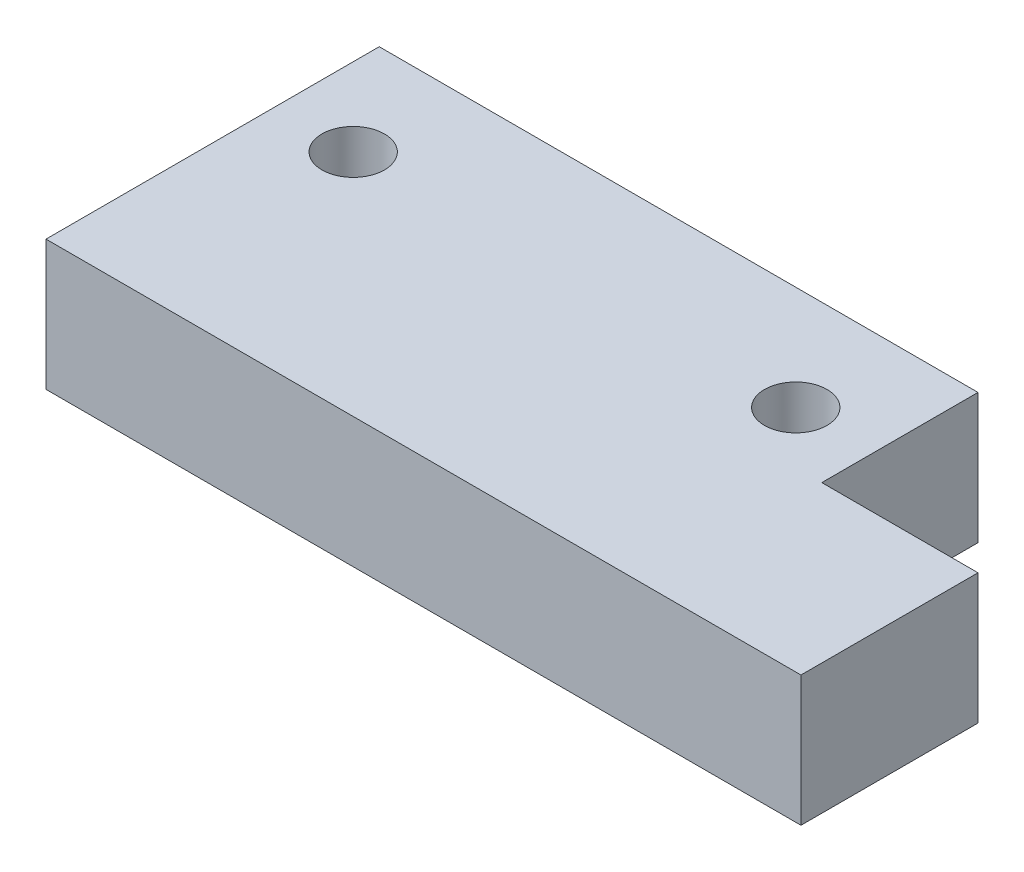
ISO-10303-21;
HEADER;
FILE_DESCRIPTION(('STEP AP214'),'2;1');
FILE_NAME('part.step','',(''),(''),'','','');
FILE_SCHEMA(('AUTOMOTIVE_DESIGN { 1 0 10303 214 1 1 1 1 }'));
ENDSEC;
DATA;
#1=APPLICATION_CONTEXT('core data for automotive mechanical design processes');
#2=APPLICATION_PROTOCOL_DEFINITION('international standard','automotive_design',2000,#1);
#3=PRODUCT_CONTEXT('',#1,'mechanical');
#4=PRODUCT('Part','Part','',(#3));
#5=PRODUCT_RELATED_PRODUCT_CATEGORY('part','',(#4));
#6=PRODUCT_DEFINITION_FORMATION('','',#4);
#7=PRODUCT_DEFINITION_CONTEXT('part definition',#1,'design');
#8=PRODUCT_DEFINITION('design','',#6,#7);
#9=PRODUCT_DEFINITION_SHAPE('','',#8);
#10=(LENGTH_UNIT() NAMED_UNIT(*) SI_UNIT(.MILLI.,.METRE.));
#11=(NAMED_UNIT(*) PLANE_ANGLE_UNIT() SI_UNIT($,.RADIAN.));
#12=(NAMED_UNIT(*) SI_UNIT($,.STERADIAN.) SOLID_ANGLE_UNIT());
#13=UNCERTAINTY_MEASURE_WITH_UNIT(LENGTH_MEASURE(1.E-05),#10,'distance_accuracy_value','');
#14=(GEOMETRIC_REPRESENTATION_CONTEXT(3) GLOBAL_UNCERTAINTY_ASSIGNED_CONTEXT((#13)) GLOBAL_UNIT_ASSIGNED_CONTEXT((#10,
#11,#12)) REPRESENTATION_CONTEXT('',''));
#15=CARTESIAN_POINT('',(0.,0.,0.));
#16=DIRECTION('',(0.,0.,1.));
#17=DIRECTION('',(1.,0.,0.));
#18=AXIS2_PLACEMENT_3D('',#15,#16,#17);
#19=CARTESIAN_POINT('',(35.,5.,0.));
#20=DIRECTION('',(-1.,0.,0.));
#21=DIRECTION('',(0.,0.,1.));
#22=AXIS2_PLACEMENT_3D('',#19,#20,#21);
#23=PLANE('',#22);
#24=DIRECTION('',(0.,0.,-1.));
#25=VECTOR('',#24,1.);
#26=CARTESIAN_POINT('',(35.,0.,0.));
#27=LINE('',#26,#25);
#28=CARTESIAN_POINT('',(35.,0.,-7.2));
#29=VERTEX_POINT('',#28);
#30=CARTESIAN_POINT('',(35.,0.,-14.));
#31=VERTEX_POINT('',#30);
#32=EDGE_CURVE('E47',#29,#31,#27,.T.);
#33=ORIENTED_EDGE('',*,*,#32,.F.);
#34=DIRECTION('',(0.,-1.,0.));
#35=VECTOR('',#34,1.);
#36=CARTESIAN_POINT('',(35.,5.,-7.2));
#37=LINE('',#36,#35);
#38=CARTESIAN_POINT('',(35.,-5.,-7.2));
#39=VERTEX_POINT('',#38);
#40=EDGE_CURVE('E40',#29,#39,#37,.T.);
#41=ORIENTED_EDGE('',*,*,#40,.T.);
#42=DIRECTION('',(0.,0.,-1.));
#43=VECTOR('',#42,1.);
#44=CARTESIAN_POINT('',(35.,-5.,0.));
#45=LINE('',#44,#43);
#46=CARTESIAN_POINT('',(35.,-5.,-14.));
#47=VERTEX_POINT('',#46);
#48=EDGE_CURVE('E110',#39,#47,#45,.T.);
#49=ORIENTED_EDGE('',*,*,#48,.T.);
#50=DIRECTION('',(0.,-1.,0.));
#51=VECTOR('',#50,1.);
#52=CARTESIAN_POINT('',(35.,5.,-14.));
#53=LINE('',#52,#51);
#54=EDGE_CURVE('E109',#31,#47,#53,.T.);
#55=ORIENTED_EDGE('',*,*,#54,.F.);
#56=EDGE_LOOP('',(#33,#41,#49,#55));
#57=FACE_BOUND('',#56,.T.);
#58=ADVANCED_FACE('F33',(#57),#23,.F.);
#59=CARTESIAN_POINT('',(0.,5.,-20.));
#60=DIRECTION('',(0.,0.,1.));
#61=DIRECTION('',(1.,0.,0.));
#62=AXIS2_PLACEMENT_3D('',#59,#60,#61);
#63=PLANE('',#62);
#64=DIRECTION('',(-1.,0.,0.));
#65=VECTOR('',#64,1.);
#66=CARTESIAN_POINT('',(0.,-5.,-20.));
#67=LINE('',#66,#65);
#68=CARTESIAN_POINT('',(29.,-5.,-20.));
#69=VERTEX_POINT('',#68);
#70=CARTESIAN_POINT('',(6.,-5.,-20.));
#71=VERTEX_POINT('',#70);
#72=EDGE_CURVE('E101',#69,#71,#67,.T.);
#73=ORIENTED_EDGE('',*,*,#72,.T.);
#74=DIRECTION('',(0.,1.,0.));
#75=VECTOR('',#74,1.);
#76=CARTESIAN_POINT('',(6.,-5.,-20.));
#77=LINE('',#76,#75);
#78=CARTESIAN_POINT('',(6.,0.,-20.));
#79=VERTEX_POINT('',#78);
#80=EDGE_CURVE('E83',#71,#79,#77,.T.);
#81=ORIENTED_EDGE('',*,*,#80,.T.);
#82=DIRECTION('',(-1.,0.,0.));
#83=VECTOR('',#82,1.);
#84=CARTESIAN_POINT('',(0.,0.,-20.));
#85=LINE('',#84,#83);
#86=CARTESIAN_POINT('',(29.,0.,-20.));
#87=VERTEX_POINT('',#86);
#88=EDGE_CURVE('E136',#87,#79,#85,.T.);
#89=ORIENTED_EDGE('',*,*,#88,.F.);
#90=DIRECTION('',(0.,-1.,0.));
#91=VECTOR('',#90,1.);
#92=CARTESIAN_POINT('',(29.,5.,-20.));
#93=LINE('',#92,#91);
#94=EDGE_CURVE('E108',#87,#69,#93,.T.);
#95=ORIENTED_EDGE('',*,*,#94,.T.);
#96=EDGE_LOOP('',(#73,#81,#89,#95));
#97=FACE_BOUND('',#96,.T.);
#98=ADVANCED_FACE('F106',(#97),#63,.F.);
#99=CARTESIAN_POINT('',(6.,5.,-7.2));
#100=DIRECTION('',(0.,0.,1.));
#101=DIRECTION('',(1.,0.,0.));
#102=AXIS2_PLACEMENT_3D('',#99,#100,#101);
#103=PLANE('',#102);
#104=ORIENTED_EDGE('',*,*,#40,.F.);
#105=DIRECTION('',(-1.,0.,0.));
#106=VECTOR('',#105,1.);
#107=CARTESIAN_POINT('',(6.,0.,-7.2));
#108=LINE('',#107,#106);
#109=CARTESIAN_POINT('',(6.,0.,-7.2));
#110=VERTEX_POINT('',#109);
#111=EDGE_CURVE('E133',#29,#110,#108,.T.);
#112=ORIENTED_EDGE('',*,*,#111,.T.);
#113=DIRECTION('',(0.,-1.,0.));
#114=VECTOR('',#113,1.);
#115=CARTESIAN_POINT('',(6.,5.,-7.2));
#116=LINE('',#115,#114);
#117=CARTESIAN_POINT('',(6.,-5.,-7.2));
#118=VERTEX_POINT('',#117);
#119=EDGE_CURVE('E129',#110,#118,#116,.T.);
#120=ORIENTED_EDGE('',*,*,#119,.T.);
#121=DIRECTION('',(-1.,0.,0.));
#122=VECTOR('',#121,1.);
#123=CARTESIAN_POINT('',(6.,-5.,-7.2));
#124=LINE('',#123,#122);
#125=EDGE_CURVE('E104',#39,#118,#124,.T.);
#126=ORIENTED_EDGE('',*,*,#125,.F.);
#127=EDGE_LOOP('',(#104,#112,#120,#126));
#128=FACE_BOUND('',#127,.T.);
#129=ADVANCED_FACE('F132',(#128),#103,.T.);
#130=CARTESIAN_POINT('',(29.,5.,-20.));
#131=DIRECTION('',(1.,0.,0.));
#132=DIRECTION('',(0.,0.,-1.));
#133=AXIS2_PLACEMENT_3D('',#130,#131,#132);
#134=PLANE('',#133);
#135=ORIENTED_EDGE('',*,*,#94,.F.);
#136=DIRECTION('',(0.,0.,1.));
#137=VECTOR('',#136,1.);
#138=CARTESIAN_POINT('',(29.,0.,-20.));
#139=LINE('',#138,#137);
#140=CARTESIAN_POINT('',(29.,0.,-14.));
#141=VERTEX_POINT('',#140);
#142=EDGE_CURVE('E138',#87,#141,#139,.T.);
#143=ORIENTED_EDGE('',*,*,#142,.T.);
#144=DIRECTION('',(0.,-1.,0.));
#145=VECTOR('',#144,1.);
#146=CARTESIAN_POINT('',(29.,5.,-14.));
#147=LINE('',#146,#145);
#148=CARTESIAN_POINT('',(29.,-5.,-14.));
#149=VERTEX_POINT('',#148);
#150=EDGE_CURVE('E112',#141,#149,#147,.T.);
#151=ORIENTED_EDGE('',*,*,#150,.T.);
#152=DIRECTION('',(0.,0.,1.));
#153=VECTOR('',#152,1.);
#154=CARTESIAN_POINT('',(29.,-5.,-20.));
#155=LINE('',#154,#153);
#156=EDGE_CURVE('E120',#69,#149,#155,.T.);
#157=ORIENTED_EDGE('',*,*,#156,.F.);
#158=EDGE_LOOP('',(#135,#143,#151,#157));
#159=FACE_BOUND('',#158,.T.);
#160=ADVANCED_FACE('F170',(#159),#134,.T.);
#161=CARTESIAN_POINT('',(35.,5.,-14.));
#162=DIRECTION('',(0.,0.,-1.));
#163=DIRECTION('',(-1.,0.,0.));
#164=AXIS2_PLACEMENT_3D('',#161,#162,#163);
#165=PLANE('',#164);
#166=ORIENTED_EDGE('',*,*,#150,.F.);
#167=DIRECTION('',(1.,0.,0.));
#168=VECTOR('',#167,1.);
#169=CARTESIAN_POINT('',(35.,0.,-14.));
#170=LINE('',#169,#168);
#171=EDGE_CURVE('E141',#141,#31,#170,.T.);
#172=ORIENTED_EDGE('',*,*,#171,.T.);
#173=ORIENTED_EDGE('',*,*,#54,.T.);
#174=DIRECTION('',(1.,0.,0.));
#175=VECTOR('',#174,1.);
#176=CARTESIAN_POINT('',(35.,-5.,-14.));
#177=LINE('',#176,#175);
#178=EDGE_CURVE('E156',#149,#47,#177,.T.);
#179=ORIENTED_EDGE('',*,*,#178,.F.);
#180=EDGE_LOOP('',(#166,#172,#173,#179));
#181=FACE_BOUND('',#180,.T.);
#182=ADVANCED_FACE('F161',(#181),#165,.T.);
#183=CARTESIAN_POINT('',(9.,5.,-16.));
#184=DIRECTION('',(0.,-1.,0.));
#185=DIRECTION('',(0.,0.,-1.));
#186=AXIS2_PLACEMENT_3D('',#183,#184,#185);
#187=CYLINDRICAL_SURFACE('',#186,1.2);
#188=CARTESIAN_POINT('',(9.,-2.,-16.));
#189=DIRECTION('',(0.,-1.,0.));
#190=DIRECTION('',(0.,0.,-1.));
#191=AXIS2_PLACEMENT_3D('',#188,#189,#190);
#192=CIRCLE('',#191,1.2);
#193=CARTESIAN_POINT('',(9.,-2.,-17.2));
#194=VERTEX_POINT('',#193);
#195=EDGE_CURVE('E117',#194,#194,#192,.T.);
#196=ORIENTED_EDGE('',*,*,#195,.T.);
#197=EDGE_LOOP('',(#196));
#198=FACE_BOUND('',#197,.T.);
#199=CARTESIAN_POINT('',(9.,0.,-16.));
#200=DIRECTION('',(0.,1.,0.));
#201=DIRECTION('',(0.,0.,1.));
#202=AXIS2_PLACEMENT_3D('',#199,#200,#201);
#203=CIRCLE('',#202,1.2);
#204=CARTESIAN_POINT('',(9.,0.,-14.8));
#205=VERTEX_POINT('',#204);
#206=EDGE_CURVE('E296',#205,#205,#203,.T.);
#207=ORIENTED_EDGE('',*,*,#206,.T.);
#208=EDGE_LOOP('',(#207));
#209=FACE_BOUND('',#208,.T.);
#210=ADVANCED_FACE('F178',(#198,#209),#187,.F.);
#211=CARTESIAN_POINT('',(26.,5.,-16.));
#212=DIRECTION('',(0.,-1.,0.));
#213=DIRECTION('',(0.,0.,-1.));
#214=AXIS2_PLACEMENT_3D('',#211,#212,#213);
#215=CYLINDRICAL_SURFACE('',#214,1.2);
#216=CARTESIAN_POINT('',(26.,-2.,-16.));
#217=DIRECTION('',(0.,-1.,0.));
#218=DIRECTION('',(0.,0.,-1.));
#219=AXIS2_PLACEMENT_3D('',#216,#217,#218);
#220=CIRCLE('',#219,1.2);
#221=CARTESIAN_POINT('',(26.,-2.,-17.2));
#222=VERTEX_POINT('',#221);
#223=EDGE_CURVE('E122',#222,#222,#220,.T.);
#224=ORIENTED_EDGE('',*,*,#223,.T.);
#225=EDGE_LOOP('',(#224));
#226=FACE_BOUND('',#225,.T.);
#227=CARTESIAN_POINT('',(26.,0.,-16.));
#228=DIRECTION('',(0.,1.,0.));
#229=DIRECTION('',(0.,0.,1.));
#230=AXIS2_PLACEMENT_3D('',#227,#228,#229);
#231=CIRCLE('',#230,1.2);
#232=CARTESIAN_POINT('',(26.,0.,-14.8));
#233=VERTEX_POINT('',#232);
#234=EDGE_CURVE('E93',#233,#233,#231,.T.);
#235=ORIENTED_EDGE('',*,*,#234,.T.);
#236=EDGE_LOOP('',(#235));
#237=FACE_BOUND('',#236,.T.);
#238=ADVANCED_FACE('F181',(#226,#237),#215,.F.);
#239=CARTESIAN_POINT('',(0.,-5.,0.));
#240=DIRECTION('',(0.,1.,0.));
#241=DIRECTION('',(0.,0.,-1.));
#242=AXIS2_PLACEMENT_3D('',#239,#240,#241);
#243=PLANE('',#242);
#244=CARTESIAN_POINT('',(9.,-5.,-16.));
#245=DIRECTION('',(0.,-1.,0.));
#246=DIRECTION('',(0.,0.,-1.));
#247=AXIS2_PLACEMENT_3D('',#244,#245,#246);
#248=CIRCLE('',#247,2.2);
#249=CARTESIAN_POINT('',(9.,-5.,-18.2));
#250=VERTEX_POINT('',#249);
#251=EDGE_CURVE('E124',#250,#250,#248,.T.);
#252=ORIENTED_EDGE('',*,*,#251,.F.);
#253=EDGE_LOOP('',(#252));
#254=FACE_BOUND('',#253,.T.);
#255=ORIENTED_EDGE('',*,*,#125,.T.);
#256=DIRECTION('',(0.,0.,-1.));
#257=VECTOR('',#256,1.);
#258=CARTESIAN_POINT('',(6.,-5.,0.));
#259=LINE('',#258,#257);
#260=EDGE_CURVE('E86',#118,#71,#259,.T.);
#261=ORIENTED_EDGE('',*,*,#260,.T.);
#262=ORIENTED_EDGE('',*,*,#72,.F.);
#263=ORIENTED_EDGE('',*,*,#156,.T.);
#264=ORIENTED_EDGE('',*,*,#178,.T.);
#265=ORIENTED_EDGE('',*,*,#48,.F.);
#266=EDGE_LOOP('',(#255,#261,#262,#263,#264,#265));
#267=FACE_BOUND('',#266,.T.);
#268=CARTESIAN_POINT('',(26.,-5.,-16.));
#269=DIRECTION('',(0.,-1.,0.));
#270=DIRECTION('',(0.,0.,-1.));
#271=AXIS2_PLACEMENT_3D('',#268,#269,#270);
#272=CIRCLE('',#271,2.2);
#273=CARTESIAN_POINT('',(26.,-5.,-18.2));
#274=VERTEX_POINT('',#273);
#275=EDGE_CURVE('E146',#274,#274,#272,.T.);
#276=ORIENTED_EDGE('',*,*,#275,.F.);
#277=EDGE_LOOP('',(#276));
#278=FACE_BOUND('',#277,.T.);
#279=ADVANCED_FACE('F98',(#254,#267,#278),#243,.F.);
#280=CARTESIAN_POINT('',(9.,-2.,-16.));
#281=DIRECTION('',(0.,-1.,0.));
#282=DIRECTION('',(0.,0.,1.));
#283=AXIS2_PLACEMENT_3D('',#280,#281,#282);
#284=CYLINDRICAL_SURFACE('',#283,2.2);
#285=CARTESIAN_POINT('',(9.,-2.,-16.));
#286=DIRECTION('',(0.,-1.,0.));
#287=DIRECTION('',(0.,0.,-1.));
#288=AXIS2_PLACEMENT_3D('',#285,#286,#287);
#289=CIRCLE('',#288,2.2);
#290=CARTESIAN_POINT('',(9.,-2.,-18.2));
#291=VERTEX_POINT('',#290);
#292=EDGE_CURVE('E121',#291,#291,#289,.T.);
#293=ORIENTED_EDGE('',*,*,#292,.F.);
#294=EDGE_LOOP('',(#293));
#295=FACE_BOUND('',#294,.T.);
#296=ORIENTED_EDGE('',*,*,#251,.T.);
#297=EDGE_LOOP('',(#296));
#298=FACE_BOUND('',#297,.T.);
#299=ADVANCED_FACE('F188',(#295,#298),#284,.F.);
#300=CARTESIAN_POINT('',(9.,-2.,-16.));
#301=DIRECTION('',(0.,1.,0.));
#302=DIRECTION('',(0.,0.,-1.));
#303=AXIS2_PLACEMENT_3D('',#300,#301,#302);
#304=PLANE('',#303);
#305=ORIENTED_EDGE('',*,*,#195,.F.);
#306=EDGE_LOOP('',(#305));
#307=FACE_BOUND('',#306,.T.);
#308=ORIENTED_EDGE('',*,*,#292,.T.);
#309=EDGE_LOOP('',(#308));
#310=FACE_BOUND('',#309,.T.);
#311=ADVANCED_FACE('F192',(#307,#310),#304,.F.);
#312=CARTESIAN_POINT('',(26.,-2.,-16.));
#313=DIRECTION('',(0.,-1.,0.));
#314=DIRECTION('',(0.,0.,1.));
#315=AXIS2_PLACEMENT_3D('',#312,#313,#314);
#316=CYLINDRICAL_SURFACE('',#315,2.2);
#317=CARTESIAN_POINT('',(26.,-2.,-16.));
#318=DIRECTION('',(0.,-1.,0.));
#319=DIRECTION('',(0.,0.,-1.));
#320=AXIS2_PLACEMENT_3D('',#317,#318,#319);
#321=CIRCLE('',#320,2.2);
#322=CARTESIAN_POINT('',(26.,-2.,-18.2));
#323=VERTEX_POINT('',#322);
#324=EDGE_CURVE('E125',#323,#323,#321,.T.);
#325=ORIENTED_EDGE('',*,*,#324,.F.);
#326=EDGE_LOOP('',(#325));
#327=FACE_BOUND('',#326,.T.);
#328=ORIENTED_EDGE('',*,*,#275,.T.);
#329=EDGE_LOOP('',(#328));
#330=FACE_BOUND('',#329,.T.);
#331=ADVANCED_FACE('F196',(#327,#330),#316,.F.);
#332=CARTESIAN_POINT('',(26.,-2.,-16.));
#333=DIRECTION('',(0.,1.,0.));
#334=DIRECTION('',(0.,0.,-1.));
#335=AXIS2_PLACEMENT_3D('',#332,#333,#334);
#336=PLANE('',#335);
#337=ORIENTED_EDGE('',*,*,#223,.F.);
#338=EDGE_LOOP('',(#337));
#339=FACE_BOUND('',#338,.T.);
#340=ORIENTED_EDGE('',*,*,#324,.T.);
#341=EDGE_LOOP('',(#340));
#342=FACE_BOUND('',#341,.T.);
#343=ADVANCED_FACE('F200',(#339,#342),#336,.F.);
#344=CARTESIAN_POINT('',(0.,0.,0.));
#345=DIRECTION('',(0.,1.,0.));
#346=DIRECTION('',(0.,0.,1.));
#347=AXIS2_PLACEMENT_3D('',#344,#345,#346);
#348=PLANE('',#347);
#349=DIRECTION('',(0.,0.,-1.));
#350=VECTOR('',#349,1.);
#351=CARTESIAN_POINT('',(6.,0.,0.));
#352=LINE('',#351,#350);
#353=EDGE_CURVE('E11',#110,#79,#352,.T.);
#354=ORIENTED_EDGE('',*,*,#353,.F.);
#355=ORIENTED_EDGE('',*,*,#111,.F.);
#356=ORIENTED_EDGE('',*,*,#32,.T.);
#357=ORIENTED_EDGE('',*,*,#171,.F.);
#358=ORIENTED_EDGE('',*,*,#142,.F.);
#359=ORIENTED_EDGE('',*,*,#88,.T.);
#360=EDGE_LOOP('',(#354,#355,#356,#357,#358,#359));
#361=FACE_BOUND('',#360,.T.);
#362=ORIENTED_EDGE('',*,*,#234,.F.);
#363=EDGE_LOOP('',(#362));
#364=FACE_BOUND('',#363,.T.);
#365=ORIENTED_EDGE('',*,*,#206,.F.);
#366=EDGE_LOOP('',(#365));
#367=FACE_BOUND('',#366,.T.);
#368=ADVANCED_FACE('F134',(#361,#364,#367),#348,.T.);
#369=CARTESIAN_POINT('',(6.,-5.,0.));
#370=DIRECTION('',(1.,0.,0.));
#371=DIRECTION('',(0.,0.,-1.));
#372=AXIS2_PLACEMENT_3D('',#369,#370,#371);
#373=PLANE('',#372);
#374=ORIENTED_EDGE('',*,*,#119,.F.);
#375=ORIENTED_EDGE('',*,*,#353,.T.);
#376=ORIENTED_EDGE('',*,*,#80,.F.);
#377=ORIENTED_EDGE('',*,*,#260,.F.);
#378=EDGE_LOOP('',(#374,#375,#376,#377));
#379=FACE_BOUND('',#378,.T.);
#380=ADVANCED_FACE('F85',(#379),#373,.F.);
#381=CLOSED_SHELL('',(#58,#98,#129,#160,#182,#210,#238,#279,#299,#311,#331,#343,#368,#380));
#382=MANIFOLD_SOLID_BREP('B2',#381);
#383=ADVANCED_BREP_SHAPE_REPRESENTATION('',(#18,#382),#14);
#384=SHAPE_DEFINITION_REPRESENTATION(#9,#383);
ENDSEC;
END-ISO-10303-21;
